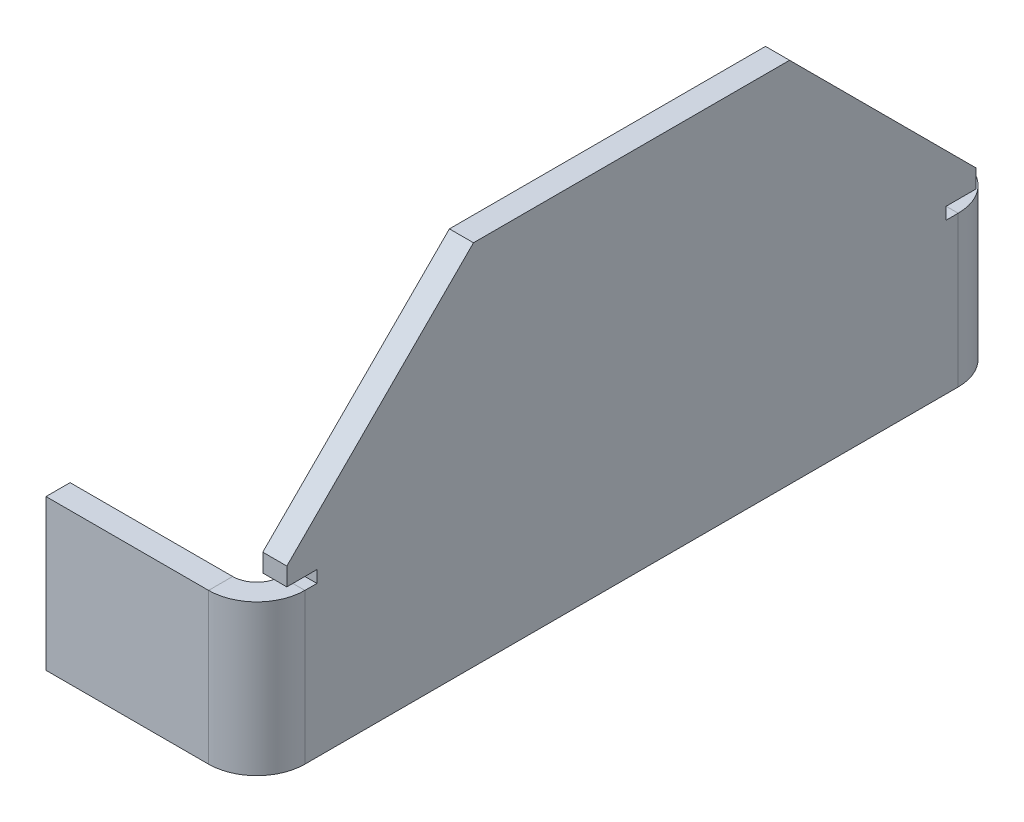
ISO-10303-21;
HEADER;
FILE_DESCRIPTION(('STEP AP214'),'2;1');
FILE_NAME('part.step','',(''),(''),'','','');
FILE_SCHEMA(('AUTOMOTIVE_DESIGN { 1 0 10303 214 1 1 1 1 }'));
ENDSEC;
DATA;
#1=APPLICATION_CONTEXT('core data for automotive mechanical design processes');
#2=APPLICATION_PROTOCOL_DEFINITION('international standard','automotive_design',2000,#1);
#3=PRODUCT_CONTEXT('',#1,'mechanical');
#4=PRODUCT('Part','Part','',(#3));
#5=PRODUCT_RELATED_PRODUCT_CATEGORY('part','',(#4));
#6=PRODUCT_DEFINITION_FORMATION('','',#4);
#7=PRODUCT_DEFINITION_CONTEXT('part definition',#1,'design');
#8=PRODUCT_DEFINITION('design','',#6,#7);
#9=PRODUCT_DEFINITION_SHAPE('','',#8);
#10=(LENGTH_UNIT() NAMED_UNIT(*) SI_UNIT(.MILLI.,.METRE.));
#11=(NAMED_UNIT(*) PLANE_ANGLE_UNIT() SI_UNIT($,.RADIAN.));
#12=(NAMED_UNIT(*) SI_UNIT($,.STERADIAN.) SOLID_ANGLE_UNIT());
#13=UNCERTAINTY_MEASURE_WITH_UNIT(LENGTH_MEASURE(1.E-05),#10,'distance_accuracy_value','');
#14=(GEOMETRIC_REPRESENTATION_CONTEXT(3) GLOBAL_UNCERTAINTY_ASSIGNED_CONTEXT((#13)) GLOBAL_UNIT_ASSIGNED_CONTEXT((#10,
#11,#12)) REPRESENTATION_CONTEXT('',''));
#15=CARTESIAN_POINT('',(0.,0.,0.));
#16=DIRECTION('',(0.,0.,1.));
#17=DIRECTION('',(1.,0.,0.));
#18=AXIS2_PLACEMENT_3D('',#15,#16,#17);
#19=CARTESIAN_POINT('',(-8.,0.,0.));
#20=DIRECTION('',(1.,0.,0.));
#21=DIRECTION('',(0.,0.,-1.));
#22=AXIS2_PLACEMENT_3D('',#19,#20,#21);
#23=PLANE('',#22);
#24=DIRECTION('',(0.,-1.,0.));
#25=VECTOR('',#24,1.);
#26=CARTESIAN_POINT('',(-7.99999999999997,0.,-108.500000000001));
#27=LINE('',#26,#25);
#28=CARTESIAN_POINT('',(-7.99999999999997,0.,-108.500000000001));
#29=VERTEX_POINT('',#28);
#30=CARTESIAN_POINT('',(-7.99999999999997,50.,-108.500000000001));
#31=VERTEX_POINT('',#30);
#32=EDGE_CURVE('E293',#29,#31,#27,.F.);
#33=ORIENTED_EDGE('',*,*,#32,.F.);
#34=DIRECTION('',(0.,0.,-1.));
#35=VECTOR('',#34,1.);
#36=CARTESIAN_POINT('',(-8.,0.,124.500000000001));
#37=LINE('',#36,#35);
#38=CARTESIAN_POINT('',(-7.99999999999999,0.,108.500000000001));
#39=VERTEX_POINT('',#38);
#40=EDGE_CURVE('E394',#39,#29,#37,.T.);
#41=ORIENTED_EDGE('',*,*,#40,.F.);
#42=DIRECTION('',(0.,1.,0.));
#43=VECTOR('',#42,1.);
#44=CARTESIAN_POINT('',(-7.99999999999999,50.,108.500000000001));
#45=LINE('',#44,#43);
#46=CARTESIAN_POINT('',(-7.99999999999999,50.,108.500000000001));
#47=VERTEX_POINT('',#46);
#48=EDGE_CURVE('E346',#47,#39,#45,.F.);
#49=ORIENTED_EDGE('',*,*,#48,.F.);
#50=DIRECTION('',(0.,0.,1.));
#51=VECTOR('',#50,1.);
#52=CARTESIAN_POINT('',(-7.99999999999999,50.,104.500000000001));
#53=LINE('',#52,#51);
#54=CARTESIAN_POINT('',(-7.99999999999999,50.,104.500000000001));
#55=VERTEX_POINT('',#54);
#56=EDGE_CURVE('E379',#55,#47,#53,.T.);
#57=ORIENTED_EDGE('',*,*,#56,.F.);
#58=DIRECTION('',(0.,-1.,0.));
#59=VECTOR('',#58,1.);
#60=CARTESIAN_POINT('',(-7.99999999999999,54.,104.500000000001));
#61=LINE('',#60,#59);
#62=CARTESIAN_POINT('',(-7.99999999999999,54.,104.500000000001));
#63=VERTEX_POINT('',#62);
#64=EDGE_CURVE('E375',#63,#55,#61,.T.);
#65=ORIENTED_EDGE('',*,*,#64,.F.);
#66=DIRECTION('',(0.,0.,-1.));
#67=VECTOR('',#66,1.);
#68=CARTESIAN_POINT('',(-7.99999999999999,54.,124.500000000001));
#69=LINE('',#68,#67);
#70=CARTESIAN_POINT('',(-7.99999999999999,54.,114.500000000001));
#71=VERTEX_POINT('',#70);
#72=EDGE_CURVE('E372',#71,#63,#69,.T.);
#73=ORIENTED_EDGE('',*,*,#72,.F.);
#74=DIRECTION('',(0.,-1.,0.));
#75=VECTOR('',#74,1.);
#76=CARTESIAN_POINT('',(-8.,60.,114.500000000001));
#77=LINE('',#76,#75);
#78=CARTESIAN_POINT('',(-8.,60.,114.500000000001));
#79=VERTEX_POINT('',#78);
#80=EDGE_CURVE('E391',#79,#71,#77,.T.);
#81=ORIENTED_EDGE('',*,*,#80,.F.);
#82=DIRECTION('',(0.,-0.707106781186544,0.707106781186551));
#83=VECTOR('',#82,1.);
#84=CARTESIAN_POINT('',(-8.,122.,52.5));
#85=LINE('',#84,#83);
#86=CARTESIAN_POINT('',(-8.,122.,52.5));
#87=VERTEX_POINT('',#86);
#88=EDGE_CURVE('E389',#87,#79,#85,.T.);
#89=ORIENTED_EDGE('',*,*,#88,.F.);
#90=DIRECTION('',(0.,0.,1.));
#91=VECTOR('',#90,1.);
#92=CARTESIAN_POINT('',(-8.,122.,52.5));
#93=LINE('',#92,#91);
#94=CARTESIAN_POINT('',(-8.,122.,-52.5));
#95=VERTEX_POINT('',#94);
#96=EDGE_CURVE('E402',#95,#87,#93,.T.);
#97=ORIENTED_EDGE('',*,*,#96,.F.);
#98=DIRECTION('',(0.,0.707106781186544,0.707106781186551));
#99=VECTOR('',#98,1.);
#100=CARTESIAN_POINT('',(-8.,122.,-52.5));
#101=LINE('',#100,#99);
#102=CARTESIAN_POINT('',(-8.,60.,-114.500000000001));
#103=VERTEX_POINT('',#102);
#104=EDGE_CURVE('E399',#103,#95,#101,.T.);
#105=ORIENTED_EDGE('',*,*,#104,.F.);
#106=DIRECTION('',(0.,1.,0.));
#107=VECTOR('',#106,1.);
#108=CARTESIAN_POINT('',(-8.,60.,-114.500000000001));
#109=LINE('',#108,#107);
#110=CARTESIAN_POINT('',(-7.99999999999997,54.,-114.500000000001));
#111=VERTEX_POINT('',#110);
#112=EDGE_CURVE('E397',#111,#103,#109,.T.);
#113=ORIENTED_EDGE('',*,*,#112,.F.);
#114=DIRECTION('',(0.,0.,-1.));
#115=VECTOR('',#114,1.);
#116=CARTESIAN_POINT('',(-7.99999999999997,54.,-104.500000000001));
#117=LINE('',#116,#115);
#118=CARTESIAN_POINT('',(-7.99999999999997,54.,-104.500000000001));
#119=VERTEX_POINT('',#118);
#120=EDGE_CURVE('E363',#119,#111,#117,.T.);
#121=ORIENTED_EDGE('',*,*,#120,.F.);
#122=DIRECTION('',(0.,1.,0.));
#123=VECTOR('',#122,1.);
#124=CARTESIAN_POINT('',(-7.99999999999997,50.,-104.500000000001));
#125=LINE('',#124,#123);
#126=CARTESIAN_POINT('',(-7.99999999999997,50.,-104.500000000001));
#127=VERTEX_POINT('',#126);
#128=EDGE_CURVE('E359',#127,#119,#125,.T.);
#129=ORIENTED_EDGE('',*,*,#128,.F.);
#130=DIRECTION('',(0.,0.,1.));
#131=VECTOR('',#130,1.);
#132=CARTESIAN_POINT('',(-7.99999999999997,50.,-108.500000000001));
#133=LINE('',#132,#131);
#134=EDGE_CURVE('E355',#31,#127,#133,.T.);
#135=ORIENTED_EDGE('',*,*,#134,.F.);
#136=EDGE_LOOP('',(#33,#41,#49,#57,#65,#73,#81,#89,#97,#105,#113,#121,#129,#135));
#137=FACE_BOUND('',#136,.T.);
#138=ADVANCED_FACE('F78',(#137),#23,.F.);
#139=CARTESIAN_POINT('',(0.,0.,0.));
#140=DIRECTION('',(1.,0.,0.));
#141=DIRECTION('',(0.,0.,-1.));
#142=AXIS2_PLACEMENT_3D('',#139,#140,#141);
#143=PLANE('',#142);
#144=DIRECTION('',(0.,0.,-1.));
#145=VECTOR('',#144,1.);
#146=CARTESIAN_POINT('',(0.,0.,124.500000000001));
#147=LINE('',#146,#145);
#148=CARTESIAN_POINT('',(0.,0.,108.500000000001));
#149=VERTEX_POINT('',#148);
#150=CARTESIAN_POINT('',(0.,0.,-108.500000000001));
#151=VERTEX_POINT('',#150);
#152=EDGE_CURVE('E409',#149,#151,#147,.T.);
#153=ORIENTED_EDGE('',*,*,#152,.T.);
#154=DIRECTION('',(0.,-1.,0.));
#155=VECTOR('',#154,1.);
#156=CARTESIAN_POINT('',(0.,0.,-108.500000000001));
#157=LINE('',#156,#155);
#158=CARTESIAN_POINT('',(0.,50.,-108.500000000001));
#159=VERTEX_POINT('',#158);
#160=EDGE_CURVE('E280',#151,#159,#157,.F.);
#161=ORIENTED_EDGE('',*,*,#160,.T.);
#162=DIRECTION('',(0.,0.,1.));
#163=VECTOR('',#162,1.);
#164=CARTESIAN_POINT('',(0.,50.,0.));
#165=LINE('',#164,#163);
#166=CARTESIAN_POINT('',(0.,50.,-104.500000000001));
#167=VERTEX_POINT('',#166);
#168=EDGE_CURVE('E13',#159,#167,#165,.T.);
#169=ORIENTED_EDGE('',*,*,#168,.T.);
#170=DIRECTION('',(0.,1.,0.));
#171=VECTOR('',#170,1.);
#172=CARTESIAN_POINT('',(0.,0.,-104.500000000001));
#173=LINE('',#172,#171);
#174=CARTESIAN_POINT('',(0.,54.,-104.500000000001));
#175=VERTEX_POINT('',#174);
#176=EDGE_CURVE('E86',#167,#175,#173,.T.);
#177=ORIENTED_EDGE('',*,*,#176,.T.);
#178=DIRECTION('',(0.,0.,-1.));
#179=VECTOR('',#178,1.);
#180=CARTESIAN_POINT('',(0.,54.0000000000001,0.));
#181=LINE('',#180,#179);
#182=CARTESIAN_POINT('',(0.,54.,-114.500000000001));
#183=VERTEX_POINT('',#182);
#184=EDGE_CURVE('E358',#175,#183,#181,.T.);
#185=ORIENTED_EDGE('',*,*,#184,.T.);
#186=DIRECTION('',(0.,1.,0.));
#187=VECTOR('',#186,1.);
#188=CARTESIAN_POINT('',(0.,60.,-114.500000000001));
#189=LINE('',#188,#187);
#190=CARTESIAN_POINT('',(0.,60.,-114.500000000001));
#191=VERTEX_POINT('',#190);
#192=EDGE_CURVE('E412',#183,#191,#189,.T.);
#193=ORIENTED_EDGE('',*,*,#192,.T.);
#194=DIRECTION('',(0.,0.707106781186544,0.707106781186551));
#195=VECTOR('',#194,1.);
#196=CARTESIAN_POINT('',(0.,122.,-52.5));
#197=LINE('',#196,#195);
#198=CARTESIAN_POINT('',(0.,122.,-52.5));
#199=VERTEX_POINT('',#198);
#200=EDGE_CURVE('E414',#191,#199,#197,.T.);
#201=ORIENTED_EDGE('',*,*,#200,.T.);
#202=DIRECTION('',(0.,0.,1.));
#203=VECTOR('',#202,1.);
#204=CARTESIAN_POINT('',(0.,122.,52.5));
#205=LINE('',#204,#203);
#206=CARTESIAN_POINT('',(0.,122.,52.5));
#207=VERTEX_POINT('',#206);
#208=EDGE_CURVE('E392',#199,#207,#205,.T.);
#209=ORIENTED_EDGE('',*,*,#208,.T.);
#210=DIRECTION('',(0.,-0.707106781186544,0.707106781186551));
#211=VECTOR('',#210,1.);
#212=CARTESIAN_POINT('',(0.,122.,52.5));
#213=LINE('',#212,#211);
#214=CARTESIAN_POINT('',(0.,60.,114.500000000001));
#215=VERTEX_POINT('',#214);
#216=EDGE_CURVE('E388',#207,#215,#213,.T.);
#217=ORIENTED_EDGE('',*,*,#216,.T.);
#218=DIRECTION('',(0.,-1.,0.));
#219=VECTOR('',#218,1.);
#220=CARTESIAN_POINT('',(0.,60.,114.500000000001));
#221=LINE('',#220,#219);
#222=CARTESIAN_POINT('',(0.,54.,114.500000000001));
#223=VERTEX_POINT('',#222);
#224=EDGE_CURVE('E406',#215,#223,#221,.T.);
#225=ORIENTED_EDGE('',*,*,#224,.T.);
#226=DIRECTION('',(0.,0.,-1.));
#227=VECTOR('',#226,1.);
#228=CARTESIAN_POINT('',(0.,54.0000000000001,0.));
#229=LINE('',#228,#227);
#230=CARTESIAN_POINT('',(0.,54.,104.500000000001));
#231=VERTEX_POINT('',#230);
#232=EDGE_CURVE('E432',#223,#231,#229,.T.);
#233=ORIENTED_EDGE('',*,*,#232,.T.);
#234=DIRECTION('',(0.,-1.,0.));
#235=VECTOR('',#234,1.);
#236=CARTESIAN_POINT('',(0.,0.,104.500000000001));
#237=LINE('',#236,#235);
#238=CARTESIAN_POINT('',(0.,50.,104.500000000001));
#239=VERTEX_POINT('',#238);
#240=EDGE_CURVE('E429',#231,#239,#237,.T.);
#241=ORIENTED_EDGE('',*,*,#240,.T.);
#242=DIRECTION('',(0.,0.,1.));
#243=VECTOR('',#242,1.);
#244=CARTESIAN_POINT('',(0.,50.,0.));
#245=LINE('',#244,#243);
#246=CARTESIAN_POINT('',(0.,50.,108.500000000001));
#247=VERTEX_POINT('',#246);
#248=EDGE_CURVE('E420',#239,#247,#245,.T.);
#249=ORIENTED_EDGE('',*,*,#248,.T.);
#250=DIRECTION('',(0.,1.,0.));
#251=VECTOR('',#250,1.);
#252=CARTESIAN_POINT('',(0.,50.,108.500000000001));
#253=LINE('',#252,#251);
#254=EDGE_CURVE('E335',#247,#149,#253,.F.);
#255=ORIENTED_EDGE('',*,*,#254,.T.);
#256=EDGE_LOOP('',(#153,#161,#169,#177,#185,#193,#201,#209,#217,#225,#233,#241,#249,#255));
#257=FACE_BOUND('',#256,.T.);
#258=ADVANCED_FACE('F439',(#257),#143,.T.);
#259=CARTESIAN_POINT('',(-8.,60.,-114.500000000001));
#260=DIRECTION('',(0.,0.,-1.));
#261=DIRECTION('',(-1.,0.,0.));
#262=AXIS2_PLACEMENT_3D('',#259,#260,#261);
#263=PLANE('',#262);
#264=ORIENTED_EDGE('',*,*,#192,.F.);
#265=DIRECTION('',(-1.,0.,0.));
#266=VECTOR('',#265,1.);
#267=CARTESIAN_POINT('',(-8.,54.,-114.500000000001));
#268=LINE('',#267,#266);
#269=EDGE_CURVE('E435',#183,#111,#268,.T.);
#270=ORIENTED_EDGE('',*,*,#269,.T.);
#271=ORIENTED_EDGE('',*,*,#112,.T.);
#272=DIRECTION('',(1.,0.,0.));
#273=VECTOR('',#272,1.);
#274=CARTESIAN_POINT('',(-8.,60.,-114.500000000001));
#275=LINE('',#274,#273);
#276=EDGE_CURVE('E423',#103,#191,#275,.T.);
#277=ORIENTED_EDGE('',*,*,#276,.T.);
#278=EDGE_LOOP('',(#264,#270,#271,#277));
#279=FACE_BOUND('',#278,.T.);
#280=ADVANCED_FACE('F457',(#279),#263,.T.);
#281=CARTESIAN_POINT('',(-8.,0.,124.500000000001));
#282=DIRECTION('',(0.,-1.,0.));
#283=DIRECTION('',(0.,0.,-1.));
#284=AXIS2_PLACEMENT_3D('',#281,#282,#283);
#285=PLANE('',#284);
#286=ORIENTED_EDGE('',*,*,#40,.T.);
#287=DIRECTION('',(1.,0.,0.));
#288=VECTOR('',#287,1.);
#289=CARTESIAN_POINT('',(-7.99999999999997,0.,-108.500000000001));
#290=LINE('',#289,#288);
#291=EDGE_CURVE('E287',#29,#151,#290,.T.);
#292=ORIENTED_EDGE('',*,*,#291,.T.);
#293=ORIENTED_EDGE('',*,*,#152,.F.);
#294=DIRECTION('',(1.,0.,0.));
#295=VECTOR('',#294,1.);
#296=CARTESIAN_POINT('',(-7.99999999999999,0.,108.500000000001));
#297=LINE('',#296,#295);
#298=EDGE_CURVE('E350',#39,#149,#297,.T.);
#299=ORIENTED_EDGE('',*,*,#298,.F.);
#300=EDGE_LOOP('',(#286,#292,#293,#299));
#301=FACE_BOUND('',#300,.T.);
#302=ADVANCED_FACE('F480',(#301),#285,.T.);
#303=CARTESIAN_POINT('',(-8.,60.,114.500000000001));
#304=DIRECTION('',(0.,0.,1.));
#305=DIRECTION('',(1.,0.,0.));
#306=AXIS2_PLACEMENT_3D('',#303,#304,#305);
#307=PLANE('',#306);
#308=ORIENTED_EDGE('',*,*,#80,.T.);
#309=DIRECTION('',(1.,0.,0.));
#310=VECTOR('',#309,1.);
#311=CARTESIAN_POINT('',(-8.,54.,114.500000000001));
#312=LINE('',#311,#310);
#313=EDGE_CURVE('E374',#71,#223,#312,.T.);
#314=ORIENTED_EDGE('',*,*,#313,.T.);
#315=ORIENTED_EDGE('',*,*,#224,.F.);
#316=DIRECTION('',(1.,0.,0.));
#317=VECTOR('',#316,1.);
#318=CARTESIAN_POINT('',(-8.,60.,114.500000000001));
#319=LINE('',#318,#317);
#320=EDGE_CURVE('E128',#79,#215,#319,.T.);
#321=ORIENTED_EDGE('',*,*,#320,.F.);
#322=EDGE_LOOP('',(#308,#314,#315,#321));
#323=FACE_BOUND('',#322,.T.);
#324=ADVANCED_FACE('F465',(#323),#307,.T.);
#325=CARTESIAN_POINT('',(-8.,122.,52.5));
#326=DIRECTION('',(0.,0.707106781186551,0.707106781186544));
#327=DIRECTION('',(0.,-0.707106781186544,0.707106781186551));
#328=AXIS2_PLACEMENT_3D('',#325,#326,#327);
#329=PLANE('',#328);
#330=ORIENTED_EDGE('',*,*,#216,.F.);
#331=DIRECTION('',(1.,0.,0.));
#332=VECTOR('',#331,1.);
#333=CARTESIAN_POINT('',(-8.,122.,52.5));
#334=LINE('',#333,#332);
#335=EDGE_CURVE('E102',#87,#207,#334,.T.);
#336=ORIENTED_EDGE('',*,*,#335,.F.);
#337=ORIENTED_EDGE('',*,*,#88,.T.);
#338=ORIENTED_EDGE('',*,*,#320,.T.);
#339=EDGE_LOOP('',(#330,#336,#337,#338));
#340=FACE_BOUND('',#339,.T.);
#341=ADVANCED_FACE('F80',(#340),#329,.T.);
#342=CARTESIAN_POINT('',(-8.,122.,52.5));
#343=DIRECTION('',(0.,1.,0.));
#344=DIRECTION('',(0.,0.,1.));
#345=AXIS2_PLACEMENT_3D('',#342,#343,#344);
#346=PLANE('',#345);
#347=ORIENTED_EDGE('',*,*,#208,.F.);
#348=DIRECTION('',(1.,0.,0.));
#349=VECTOR('',#348,1.);
#350=CARTESIAN_POINT('',(-8.,122.,-52.5));
#351=LINE('',#350,#349);
#352=EDGE_CURVE('E421',#95,#199,#351,.T.);
#353=ORIENTED_EDGE('',*,*,#352,.F.);
#354=ORIENTED_EDGE('',*,*,#96,.T.);
#355=ORIENTED_EDGE('',*,*,#335,.T.);
#356=EDGE_LOOP('',(#347,#353,#354,#355));
#357=FACE_BOUND('',#356,.T.);
#358=ADVANCED_FACE('F461',(#357),#346,.T.);
#359=CARTESIAN_POINT('',(-8.,122.,-52.5));
#360=DIRECTION('',(0.,0.707106781186552,-0.707106781186544));
#361=DIRECTION('',(0.,0.707106781186544,0.707106781186552));
#362=AXIS2_PLACEMENT_3D('',#359,#360,#361);
#363=PLANE('',#362);
#364=ORIENTED_EDGE('',*,*,#200,.F.);
#365=ORIENTED_EDGE('',*,*,#276,.F.);
#366=ORIENTED_EDGE('',*,*,#104,.T.);
#367=ORIENTED_EDGE('',*,*,#352,.T.);
#368=EDGE_LOOP('',(#364,#365,#366,#367));
#369=FACE_BOUND('',#368,.T.);
#370=ADVANCED_FACE('F463',(#369),#363,.T.);
#371=CARTESIAN_POINT('',(-7.99999999999999,54.,124.500000000001));
#372=DIRECTION('',(0.,-1.,0.));
#373=DIRECTION('',(0.,0.,-1.));
#374=AXIS2_PLACEMENT_3D('',#371,#372,#373);
#375=PLANE('',#374);
#376=ORIENTED_EDGE('',*,*,#313,.F.);
#377=ORIENTED_EDGE('',*,*,#72,.T.);
#378=DIRECTION('',(1.,0.,0.));
#379=VECTOR('',#378,1.);
#380=CARTESIAN_POINT('',(-7.99999999999999,54.,104.500000000001));
#381=LINE('',#380,#379);
#382=EDGE_CURVE('E378',#63,#231,#381,.T.);
#383=ORIENTED_EDGE('',*,*,#382,.T.);
#384=ORIENTED_EDGE('',*,*,#232,.F.);
#385=EDGE_LOOP('',(#376,#377,#383,#384));
#386=FACE_BOUND('',#385,.T.);
#387=ADVANCED_FACE('F467',(#386),#375,.T.);
#388=CARTESIAN_POINT('',(-7.99999999999999,54.,104.500000000001));
#389=DIRECTION('',(0.,0.,1.));
#390=DIRECTION('',(1.,0.,0.));
#391=AXIS2_PLACEMENT_3D('',#388,#389,#390);
#392=PLANE('',#391);
#393=ORIENTED_EDGE('',*,*,#240,.F.);
#394=ORIENTED_EDGE('',*,*,#382,.F.);
#395=ORIENTED_EDGE('',*,*,#64,.T.);
#396=DIRECTION('',(1.,0.,0.));
#397=VECTOR('',#396,1.);
#398=CARTESIAN_POINT('',(-7.99999999999999,50.,104.500000000001));
#399=LINE('',#398,#397);
#400=EDGE_CURVE('E371',#55,#239,#399,.T.);
#401=ORIENTED_EDGE('',*,*,#400,.T.);
#402=EDGE_LOOP('',(#393,#394,#395,#401));
#403=FACE_BOUND('',#402,.T.);
#404=ADVANCED_FACE('F471',(#403),#392,.T.);
#405=CARTESIAN_POINT('',(-7.99999999999999,50.,104.500000000001));
#406=DIRECTION('',(0.,1.,0.));
#407=DIRECTION('',(0.,0.,1.));
#408=AXIS2_PLACEMENT_3D('',#405,#406,#407);
#409=PLANE('',#408);
#410=ORIENTED_EDGE('',*,*,#248,.F.);
#411=ORIENTED_EDGE('',*,*,#400,.F.);
#412=ORIENTED_EDGE('',*,*,#56,.T.);
#413=DIRECTION('',(1.,0.,0.));
#414=VECTOR('',#413,1.);
#415=CARTESIAN_POINT('',(-7.99999999999999,50.,108.500000000001));
#416=LINE('',#415,#414);
#417=EDGE_CURVE('E340',#47,#247,#416,.T.);
#418=ORIENTED_EDGE('',*,*,#417,.T.);
#419=EDGE_LOOP('',(#410,#411,#412,#418));
#420=FACE_BOUND('',#419,.T.);
#421=ADVANCED_FACE('F476',(#420),#409,.T.);
#422=CARTESIAN_POINT('',(-7.99999999999997,50.,-108.500000000001));
#423=DIRECTION('',(0.,1.,0.));
#424=DIRECTION('',(0.,0.,1.));
#425=AXIS2_PLACEMENT_3D('',#422,#423,#424);
#426=PLANE('',#425);
#427=ORIENTED_EDGE('',*,*,#168,.F.);
#428=DIRECTION('',(1.,0.,0.));
#429=VECTOR('',#428,1.);
#430=CARTESIAN_POINT('',(-7.99999999999997,50.,-108.500000000001));
#431=LINE('',#430,#429);
#432=EDGE_CURVE('E297',#31,#159,#431,.T.);
#433=ORIENTED_EDGE('',*,*,#432,.F.);
#434=ORIENTED_EDGE('',*,*,#134,.T.);
#435=DIRECTION('',(1.,0.,0.));
#436=VECTOR('',#435,1.);
#437=CARTESIAN_POINT('',(-7.99999999999997,50.,-104.500000000001));
#438=LINE('',#437,#436);
#439=EDGE_CURVE('E362',#127,#167,#438,.T.);
#440=ORIENTED_EDGE('',*,*,#439,.T.);
#441=EDGE_LOOP('',(#427,#433,#434,#440));
#442=FACE_BOUND('',#441,.T.);
#443=ADVANCED_FACE('F445',(#442),#426,.T.);
#444=CARTESIAN_POINT('',(-7.99999999999997,50.,-104.500000000001));
#445=DIRECTION('',(0.,0.,-1.));
#446=DIRECTION('',(-1.,0.,0.));
#447=AXIS2_PLACEMENT_3D('',#444,#445,#446);
#448=PLANE('',#447);
#449=ORIENTED_EDGE('',*,*,#176,.F.);
#450=ORIENTED_EDGE('',*,*,#439,.F.);
#451=ORIENTED_EDGE('',*,*,#128,.T.);
#452=DIRECTION('',(1.,0.,0.));
#453=VECTOR('',#452,1.);
#454=CARTESIAN_POINT('',(-7.99999999999997,54.,-104.500000000001));
#455=LINE('',#454,#453);
#456=EDGE_CURVE('E352',#119,#175,#455,.T.);
#457=ORIENTED_EDGE('',*,*,#456,.T.);
#458=EDGE_LOOP('',(#449,#450,#451,#457));
#459=FACE_BOUND('',#458,.T.);
#460=ADVANCED_FACE('F443',(#459),#448,.T.);
#461=CARTESIAN_POINT('',(-7.99999999999997,54.,-104.500000000001));
#462=DIRECTION('',(0.,-1.,0.));
#463=DIRECTION('',(0.,0.,-1.));
#464=AXIS2_PLACEMENT_3D('',#461,#462,#463);
#465=PLANE('',#464);
#466=ORIENTED_EDGE('',*,*,#184,.F.);
#467=ORIENTED_EDGE('',*,*,#456,.F.);
#468=ORIENTED_EDGE('',*,*,#120,.T.);
#469=ORIENTED_EDGE('',*,*,#269,.F.);
#470=EDGE_LOOP('',(#466,#467,#468,#469));
#471=FACE_BOUND('',#470,.T.);
#472=ADVANCED_FACE('F455',(#471),#465,.T.);
#473=CARTESIAN_POINT('',(-16.,0.,108.500000000001));
#474=DIRECTION('',(0.,-1.,0.));
#475=DIRECTION('',(0.,0.,-1.));
#476=AXIS2_PLACEMENT_3D('',#473,#474,#475);
#477=PLANE('',#476);
#478=DIRECTION('',(0.,0.,1.));
#479=VECTOR('',#478,1.);
#480=CARTESIAN_POINT('',(-16.,0.,124.500000000001));
#481=LINE('',#480,#479);
#482=CARTESIAN_POINT('',(-16.,0.,116.500000000001));
#483=VERTEX_POINT('',#482);
#484=CARTESIAN_POINT('',(-15.9999999999999,0.,124.500000000001));
#485=VERTEX_POINT('',#484);
#486=EDGE_CURVE('E300',#483,#485,#481,.T.);
#487=ORIENTED_EDGE('',*,*,#486,.F.);
#488=CARTESIAN_POINT('',(-16.,0.,108.500000000001));
#489=DIRECTION('',(0.,1.,0.));
#490=DIRECTION('',(0.,0.,1.));
#491=AXIS2_PLACEMENT_3D('',#488,#489,#490);
#492=CIRCLE('',#491,7.99999999999999);
#493=EDGE_CURVE('E343',#39,#483,#492,.F.);
#494=ORIENTED_EDGE('',*,*,#493,.F.);
#495=ORIENTED_EDGE('',*,*,#298,.T.);
#496=CARTESIAN_POINT('',(-16.,0.,108.500000000001));
#497=DIRECTION('',(0.,1.,0.));
#498=DIRECTION('',(0.,0.,1.));
#499=AXIS2_PLACEMENT_3D('',#496,#497,#498);
#500=CIRCLE('',#499,16.);
#501=EDGE_CURVE('E93',#149,#485,#500,.F.);
#502=ORIENTED_EDGE('',*,*,#501,.T.);
#503=EDGE_LOOP('',(#487,#494,#495,#502));
#504=FACE_BOUND('',#503,.T.);
#505=ADVANCED_FACE('F570',(#504),#477,.T.);
#506=CARTESIAN_POINT('',(-16.,50.,108.500000000001));
#507=DIRECTION('',(0.,-1.,0.));
#508=DIRECTION('',(0.,0.,-1.));
#509=AXIS2_PLACEMENT_3D('',#506,#507,#508);
#510=PLANE('',#509);
#511=CARTESIAN_POINT('',(-16.,50.,108.500000000001));
#512=DIRECTION('',(0.,1.,0.));
#513=DIRECTION('',(0.,0.,1.));
#514=AXIS2_PLACEMENT_3D('',#511,#512,#513);
#515=CIRCLE('',#514,7.99999999999999);
#516=CARTESIAN_POINT('',(-16.,50.,116.500000000001));
#517=VERTEX_POINT('',#516);
#518=EDGE_CURVE('E305',#517,#47,#515,.T.);
#519=ORIENTED_EDGE('',*,*,#518,.F.);
#520=DIRECTION('',(0.,0.,1.));
#521=VECTOR('',#520,1.);
#522=CARTESIAN_POINT('',(-16.,50.,116.500000000001));
#523=LINE('',#522,#521);
#524=CARTESIAN_POINT('',(-16.,50.,124.500000000001));
#525=VERTEX_POINT('',#524);
#526=EDGE_CURVE('E328',#517,#525,#523,.T.);
#527=ORIENTED_EDGE('',*,*,#526,.T.);
#528=CARTESIAN_POINT('',(-16.,50.,108.500000000001));
#529=DIRECTION('',(0.,1.,0.));
#530=DIRECTION('',(0.,0.,1.));
#531=AXIS2_PLACEMENT_3D('',#528,#529,#530);
#532=CIRCLE('',#531,16.);
#533=EDGE_CURVE('E338',#525,#247,#532,.T.);
#534=ORIENTED_EDGE('',*,*,#533,.T.);
#535=ORIENTED_EDGE('',*,*,#417,.F.);
#536=EDGE_LOOP('',(#519,#527,#534,#535));
#537=FACE_BOUND('',#536,.T.);
#538=ADVANCED_FACE('F577',(#537),#510,.F.);
#539=CARTESIAN_POINT('',(-16.,50.,108.500000000001));
#540=DIRECTION('',(0.,1.,0.));
#541=DIRECTION('',(0.,0.,1.));
#542=AXIS2_PLACEMENT_3D('',#539,#540,#541);
#543=CYLINDRICAL_SURFACE('',#542,16.);
#544=ORIENTED_EDGE('',*,*,#254,.F.);
#545=ORIENTED_EDGE('',*,*,#533,.F.);
#546=DIRECTION('',(0.,1.,0.));
#547=VECTOR('',#546,1.);
#548=CARTESIAN_POINT('',(-16.,0.,124.500000000001));
#549=LINE('',#548,#547);
#550=EDGE_CURVE('E325',#485,#525,#549,.T.);
#551=ORIENTED_EDGE('',*,*,#550,.F.);
#552=ORIENTED_EDGE('',*,*,#501,.F.);
#553=EDGE_LOOP('',(#544,#545,#551,#552));
#554=FACE_BOUND('',#553,.T.);
#555=ADVANCED_FACE('F585',(#554),#543,.T.);
#556=CARTESIAN_POINT('',(-16.,50.,108.500000000001));
#557=DIRECTION('',(0.,1.,0.));
#558=DIRECTION('',(0.,0.,1.));
#559=AXIS2_PLACEMENT_3D('',#556,#557,#558);
#560=CYLINDRICAL_SURFACE('',#559,7.99999999999999);
#561=ORIENTED_EDGE('',*,*,#48,.T.);
#562=ORIENTED_EDGE('',*,*,#493,.T.);
#563=DIRECTION('',(0.,-1.,0.));
#564=VECTOR('',#563,1.);
#565=CARTESIAN_POINT('',(-16.,0.,116.500000000001));
#566=LINE('',#565,#564);
#567=EDGE_CURVE('E331',#483,#517,#566,.F.);
#568=ORIENTED_EDGE('',*,*,#567,.T.);
#569=ORIENTED_EDGE('',*,*,#518,.T.);
#570=EDGE_LOOP('',(#561,#562,#568,#569));
#571=FACE_BOUND('',#570,.T.);
#572=ADVANCED_FACE('F593',(#571),#560,.F.);
#573=CARTESIAN_POINT('',(-7.99999999999997,50.,124.500000000001));
#574=DIRECTION('',(0.,1.,0.));
#575=DIRECTION('',(-1.,0.,0.));
#576=AXIS2_PLACEMENT_3D('',#573,#574,#575);
#577=PLANE('',#576);
#578=DIRECTION('',(1.,0.,0.));
#579=VECTOR('',#578,1.);
#580=CARTESIAN_POINT('',(-7.99999999999997,50.,124.500000000001));
#581=LINE('',#580,#579);
#582=CARTESIAN_POINT('',(-70.,49.9999999999999,124.500000000001));
#583=VERTEX_POINT('',#582);
#584=EDGE_CURVE('E309',#583,#525,#581,.T.);
#585=ORIENTED_EDGE('',*,*,#584,.T.);
#586=ORIENTED_EDGE('',*,*,#526,.F.);
#587=DIRECTION('',(-1.,0.,0.));
#588=VECTOR('',#587,1.);
#589=CARTESIAN_POINT('',(3.89921070342144E-13,50.,116.500000000001));
#590=LINE('',#589,#588);
#591=CARTESIAN_POINT('',(-70.,49.9999999999999,116.500000000001));
#592=VERTEX_POINT('',#591);
#593=EDGE_CURVE('E317',#592,#517,#590,.F.);
#594=ORIENTED_EDGE('',*,*,#593,.F.);
#595=DIRECTION('',(0.,0.,-1.));
#596=VECTOR('',#595,1.);
#597=CARTESIAN_POINT('',(-70.,49.9999999999999,124.500000000001));
#598=LINE('',#597,#596);
#599=EDGE_CURVE('E303',#583,#592,#598,.T.);
#600=ORIENTED_EDGE('',*,*,#599,.F.);
#601=EDGE_LOOP('',(#585,#586,#594,#600));
#602=FACE_BOUND('',#601,.T.);
#603=ADVANCED_FACE('F600',(#602),#577,.T.);
#604=CARTESIAN_POINT('',(-70.,0.,124.500000000001));
#605=DIRECTION('',(0.,-1.,0.));
#606=DIRECTION('',(1.,0.,0.));
#607=AXIS2_PLACEMENT_3D('',#604,#605,#606);
#608=PLANE('',#607);
#609=DIRECTION('',(1.,0.,0.));
#610=VECTOR('',#609,1.);
#611=CARTESIAN_POINT('',(4.45879892147847E-13,0.,116.500000000001));
#612=LINE('',#611,#610);
#613=CARTESIAN_POINT('',(-70.,0.,116.500000000001));
#614=VERTEX_POINT('',#613);
#615=EDGE_CURVE('E323',#483,#614,#612,.F.);
#616=ORIENTED_EDGE('',*,*,#615,.F.);
#617=ORIENTED_EDGE('',*,*,#486,.T.);
#618=DIRECTION('',(-1.,0.,0.));
#619=VECTOR('',#618,1.);
#620=CARTESIAN_POINT('',(-70.,0.,124.500000000001));
#621=LINE('',#620,#619);
#622=CARTESIAN_POINT('',(-70.,0.,124.500000000001));
#623=VERTEX_POINT('',#622);
#624=EDGE_CURVE('E315',#485,#623,#621,.T.);
#625=ORIENTED_EDGE('',*,*,#624,.T.);
#626=DIRECTION('',(0.,0.,-1.));
#627=VECTOR('',#626,1.);
#628=CARTESIAN_POINT('',(-70.,0.,124.500000000001));
#629=LINE('',#628,#627);
#630=EDGE_CURVE('E306',#623,#614,#629,.T.);
#631=ORIENTED_EDGE('',*,*,#630,.T.);
#632=EDGE_LOOP('',(#616,#617,#625,#631));
#633=FACE_BOUND('',#632,.T.);
#634=ADVANCED_FACE('F608',(#633),#608,.T.);
#635=CARTESIAN_POINT('',(4.73811742858592E-13,0.,124.500000000001));
#636=DIRECTION('',(0.,0.,1.));
#637=DIRECTION('',(1.,0.,0.));
#638=AXIS2_PLACEMENT_3D('',#635,#636,#637);
#639=PLANE('',#638);
#640=ORIENTED_EDGE('',*,*,#624,.F.);
#641=ORIENTED_EDGE('',*,*,#550,.T.);
#642=ORIENTED_EDGE('',*,*,#584,.F.);
#643=DIRECTION('',(0.,1.,0.));
#644=VECTOR('',#643,1.);
#645=CARTESIAN_POINT('',(-70.,49.9999999999999,124.500000000001));
#646=LINE('',#645,#644);
#647=EDGE_CURVE('E312',#623,#583,#646,.T.);
#648=ORIENTED_EDGE('',*,*,#647,.F.);
#649=EDGE_LOOP('',(#640,#641,#642,#648));
#650=FACE_BOUND('',#649,.T.);
#651=ADVANCED_FACE('F616',(#650),#639,.T.);
#652=CARTESIAN_POINT('',(4.45879892147847E-13,0.,116.500000000001));
#653=DIRECTION('',(0.,0.,1.));
#654=DIRECTION('',(1.,0.,0.));
#655=AXIS2_PLACEMENT_3D('',#652,#653,#654);
#656=PLANE('',#655);
#657=ORIENTED_EDGE('',*,*,#567,.F.);
#658=ORIENTED_EDGE('',*,*,#615,.T.);
#659=DIRECTION('',(0.,-1.,0.));
#660=VECTOR('',#659,1.);
#661=CARTESIAN_POINT('',(-70.,0.,116.500000000001));
#662=LINE('',#661,#660);
#663=EDGE_CURVE('E320',#614,#592,#662,.F.);
#664=ORIENTED_EDGE('',*,*,#663,.T.);
#665=ORIENTED_EDGE('',*,*,#593,.T.);
#666=EDGE_LOOP('',(#657,#658,#664,#665));
#667=FACE_BOUND('',#666,.T.);
#668=ADVANCED_FACE('F624',(#667),#656,.F.);
#669=CARTESIAN_POINT('',(-70.,49.9999999999999,124.500000000001));
#670=DIRECTION('',(-1.,0.,0.));
#671=DIRECTION('',(0.,0.,1.));
#672=AXIS2_PLACEMENT_3D('',#669,#670,#671);
#673=PLANE('',#672);
#674=ORIENTED_EDGE('',*,*,#663,.F.);
#675=ORIENTED_EDGE('',*,*,#630,.F.);
#676=ORIENTED_EDGE('',*,*,#647,.T.);
#677=ORIENTED_EDGE('',*,*,#599,.T.);
#678=EDGE_LOOP('',(#674,#675,#676,#677));
#679=FACE_BOUND('',#678,.T.);
#680=ADVANCED_FACE('F632',(#679),#673,.T.);
#681=CARTESIAN_POINT('',(-16.,50.,-108.500000000001));
#682=DIRECTION('',(0.,1.,0.));
#683=DIRECTION('',(0.,0.,1.));
#684=AXIS2_PLACEMENT_3D('',#681,#682,#683);
#685=PLANE('',#684);
#686=DIRECTION('',(0.,0.,-1.));
#687=VECTOR('',#686,1.);
#688=CARTESIAN_POINT('',(-16.,50.,-124.500000000001));
#689=LINE('',#688,#687);
#690=CARTESIAN_POINT('',(-16.,50.,-116.500000000001));
#691=VERTEX_POINT('',#690);
#692=CARTESIAN_POINT('',(-15.9999999999999,50.,-124.500000000001));
#693=VERTEX_POINT('',#692);
#694=EDGE_CURVE('E277',#691,#693,#689,.T.);
#695=ORIENTED_EDGE('',*,*,#694,.F.);
#696=CARTESIAN_POINT('',(-16.,50.,-108.500000000001));
#697=DIRECTION('',(0.,-1.,0.));
#698=DIRECTION('',(0.,0.,-1.));
#699=AXIS2_PLACEMENT_3D('',#696,#697,#698);
#700=CIRCLE('',#699,8.00000000000002);
#701=EDGE_CURVE('E290',#31,#691,#700,.F.);
#702=ORIENTED_EDGE('',*,*,#701,.F.);
#703=ORIENTED_EDGE('',*,*,#432,.T.);
#704=CARTESIAN_POINT('',(-16.,50.,-108.500000000001));
#705=DIRECTION('',(0.,-1.,0.));
#706=DIRECTION('',(0.,0.,-1.));
#707=AXIS2_PLACEMENT_3D('',#704,#705,#706);
#708=CIRCLE('',#707,16.);
#709=EDGE_CURVE('E283',#159,#693,#708,.F.);
#710=ORIENTED_EDGE('',*,*,#709,.T.);
#711=EDGE_LOOP('',(#695,#702,#703,#710));
#712=FACE_BOUND('',#711,.T.);
#713=ADVANCED_FACE('F494',(#712),#685,.T.);
#714=CARTESIAN_POINT('',(-16.,0.,-108.500000000001));
#715=DIRECTION('',(0.,1.,0.));
#716=DIRECTION('',(0.,0.,1.));
#717=AXIS2_PLACEMENT_3D('',#714,#715,#716);
#718=PLANE('',#717);
#719=CARTESIAN_POINT('',(-16.,0.,-108.500000000001));
#720=DIRECTION('',(0.,-1.,0.));
#721=DIRECTION('',(0.,0.,-1.));
#722=AXIS2_PLACEMENT_3D('',#719,#720,#721);
#723=CIRCLE('',#722,8.00000000000002);
#724=CARTESIAN_POINT('',(-16.,0.,-116.500000000001));
#725=VERTEX_POINT('',#724);
#726=EDGE_CURVE('E247',#725,#29,#723,.T.);
#727=ORIENTED_EDGE('',*,*,#726,.F.);
#728=DIRECTION('',(0.,0.,-1.));
#729=VECTOR('',#728,1.);
#730=CARTESIAN_POINT('',(-16.,0.,-116.500000000001));
#731=LINE('',#730,#729);
#732=CARTESIAN_POINT('',(-16.,0.,-124.500000000001));
#733=VERTEX_POINT('',#732);
#734=EDGE_CURVE('E272',#725,#733,#731,.T.);
#735=ORIENTED_EDGE('',*,*,#734,.T.);
#736=CARTESIAN_POINT('',(-16.,0.,-108.500000000001));
#737=DIRECTION('',(0.,-1.,0.));
#738=DIRECTION('',(0.,0.,-1.));
#739=AXIS2_PLACEMENT_3D('',#736,#737,#738);
#740=CIRCLE('',#739,16.);
#741=EDGE_CURVE('E284',#733,#151,#740,.T.);
#742=ORIENTED_EDGE('',*,*,#741,.T.);
#743=ORIENTED_EDGE('',*,*,#291,.F.);
#744=EDGE_LOOP('',(#727,#735,#742,#743));
#745=FACE_BOUND('',#744,.T.);
#746=ADVANCED_FACE('F483',(#745),#718,.F.);
#747=CARTESIAN_POINT('',(-16.,0.,-108.500000000001));
#748=DIRECTION('',(0.,-1.,0.));
#749=DIRECTION('',(0.,0.,-1.));
#750=AXIS2_PLACEMENT_3D('',#747,#748,#749);
#751=CYLINDRICAL_SURFACE('',#750,16.);
#752=ORIENTED_EDGE('',*,*,#160,.F.);
#753=ORIENTED_EDGE('',*,*,#741,.F.);
#754=DIRECTION('',(0.,-1.,0.));
#755=VECTOR('',#754,1.);
#756=CARTESIAN_POINT('',(-16.,50.,-124.500000000001));
#757=LINE('',#756,#755);
#758=EDGE_CURVE('E256',#733,#693,#757,.F.);
#759=ORIENTED_EDGE('',*,*,#758,.T.);
#760=ORIENTED_EDGE('',*,*,#709,.F.);
#761=EDGE_LOOP('',(#752,#753,#759,#760));
#762=FACE_BOUND('',#761,.T.);
#763=ADVANCED_FACE('F496',(#762),#751,.T.);
#764=CARTESIAN_POINT('',(-16.,0.,-108.500000000001));
#765=DIRECTION('',(0.,-1.,0.));
#766=DIRECTION('',(0.,0.,-1.));
#767=AXIS2_PLACEMENT_3D('',#764,#765,#766);
#768=CYLINDRICAL_SURFACE('',#767,8.00000000000002);
#769=ORIENTED_EDGE('',*,*,#32,.T.);
#770=ORIENTED_EDGE('',*,*,#701,.T.);
#771=DIRECTION('',(0.,-1.,0.));
#772=VECTOR('',#771,1.);
#773=CARTESIAN_POINT('',(-16.,50.,-116.500000000001));
#774=LINE('',#773,#772);
#775=EDGE_CURVE('E275',#691,#725,#774,.T.);
#776=ORIENTED_EDGE('',*,*,#775,.T.);
#777=ORIENTED_EDGE('',*,*,#726,.T.);
#778=EDGE_LOOP('',(#769,#770,#776,#777));
#779=FACE_BOUND('',#778,.T.);
#780=ADVANCED_FACE('F485',(#779),#768,.F.);
#781=CARTESIAN_POINT('',(-7.99999999999997,50.,-124.500000000001));
#782=DIRECTION('',(0.,1.,0.));
#783=DIRECTION('',(-1.,0.,0.));
#784=AXIS2_PLACEMENT_3D('',#781,#782,#783);
#785=PLANE('',#784);
#786=DIRECTION('',(-1.,0.,0.));
#787=VECTOR('',#786,1.);
#788=CARTESIAN_POINT('',(3.89921070342144E-13,50.,-116.500000000001));
#789=LINE('',#788,#787);
#790=CARTESIAN_POINT('',(-70.,49.9999999999999,-116.500000000001));
#791=VERTEX_POINT('',#790);
#792=EDGE_CURVE('E269',#691,#791,#789,.T.);
#793=ORIENTED_EDGE('',*,*,#792,.F.);
#794=ORIENTED_EDGE('',*,*,#694,.T.);
#795=DIRECTION('',(1.,0.,0.));
#796=VECTOR('',#795,1.);
#797=CARTESIAN_POINT('',(-7.99999999999997,50.,-124.500000000001));
#798=LINE('',#797,#796);
#799=CARTESIAN_POINT('',(-70.,49.9999999999999,-124.500000000001));
#800=VERTEX_POINT('',#799);
#801=EDGE_CURVE('E261',#693,#800,#798,.F.);
#802=ORIENTED_EDGE('',*,*,#801,.T.);
#803=DIRECTION('',(0.,0.,1.));
#804=VECTOR('',#803,1.);
#805=CARTESIAN_POINT('',(-70.,49.9999999999999,-124.500000000001));
#806=LINE('',#805,#804);
#807=EDGE_CURVE('E248',#800,#791,#806,.T.);
#808=ORIENTED_EDGE('',*,*,#807,.T.);
#809=EDGE_LOOP('',(#793,#794,#802,#808));
#810=FACE_BOUND('',#809,.T.);
#811=ADVANCED_FACE('F492',(#810),#785,.T.);
#812=CARTESIAN_POINT('',(-70.,0.,-124.500000000001));
#813=DIRECTION('',(0.,-1.,0.));
#814=DIRECTION('',(1.,0.,0.));
#815=AXIS2_PLACEMENT_3D('',#812,#813,#814);
#816=PLANE('',#815);
#817=DIRECTION('',(-1.,0.,0.));
#818=VECTOR('',#817,1.);
#819=CARTESIAN_POINT('',(-70.,0.,-124.500000000001));
#820=LINE('',#819,#818);
#821=CARTESIAN_POINT('',(-70.,0.,-124.500000000001));
#822=VERTEX_POINT('',#821);
#823=EDGE_CURVE('E240',#822,#733,#820,.F.);
#824=ORIENTED_EDGE('',*,*,#823,.T.);
#825=ORIENTED_EDGE('',*,*,#734,.F.);
#826=DIRECTION('',(1.,0.,0.));
#827=VECTOR('',#826,1.);
#828=CARTESIAN_POINT('',(4.45879892147847E-13,0.,-116.500000000001));
#829=LINE('',#828,#827);
#830=CARTESIAN_POINT('',(-70.,0.,-116.500000000001));
#831=VERTEX_POINT('',#830);
#832=EDGE_CURVE('E242',#831,#725,#829,.T.);
#833=ORIENTED_EDGE('',*,*,#832,.F.);
#834=DIRECTION('',(0.,0.,1.));
#835=VECTOR('',#834,1.);
#836=CARTESIAN_POINT('',(-70.,0.,-124.500000000001));
#837=LINE('',#836,#835);
#838=EDGE_CURVE('E236',#822,#831,#837,.T.);
#839=ORIENTED_EDGE('',*,*,#838,.F.);
#840=EDGE_LOOP('',(#824,#825,#833,#839));
#841=FACE_BOUND('',#840,.T.);
#842=ADVANCED_FACE('F238',(#841),#816,.T.);
#843=CARTESIAN_POINT('',(4.73811742858592E-13,0.,-124.500000000001));
#844=DIRECTION('',(0.,0.,1.));
#845=DIRECTION('',(1.,0.,0.));
#846=AXIS2_PLACEMENT_3D('',#843,#844,#845);
#847=PLANE('',#846);
#848=ORIENTED_EDGE('',*,*,#758,.F.);
#849=ORIENTED_EDGE('',*,*,#823,.F.);
#850=DIRECTION('',(0.,1.,0.));
#851=VECTOR('',#850,1.);
#852=CARTESIAN_POINT('',(-70.,49.9999999999999,-124.500000000001));
#853=LINE('',#852,#851);
#854=EDGE_CURVE('E255',#800,#822,#853,.F.);
#855=ORIENTED_EDGE('',*,*,#854,.F.);
#856=ORIENTED_EDGE('',*,*,#801,.F.);
#857=EDGE_LOOP('',(#848,#849,#855,#856));
#858=FACE_BOUND('',#857,.T.);
#859=ADVANCED_FACE('F253',(#858),#847,.F.);
#860=CARTESIAN_POINT('',(4.45879892147847E-13,0.,-116.500000000001));
#861=DIRECTION('',(0.,0.,1.));
#862=DIRECTION('',(1.,0.,0.));
#863=AXIS2_PLACEMENT_3D('',#860,#861,#862);
#864=PLANE('',#863);
#865=ORIENTED_EDGE('',*,*,#832,.T.);
#866=ORIENTED_EDGE('',*,*,#775,.F.);
#867=ORIENTED_EDGE('',*,*,#792,.T.);
#868=DIRECTION('',(0.,-1.,0.));
#869=VECTOR('',#868,1.);
#870=CARTESIAN_POINT('',(-70.,0.,-116.500000000001));
#871=LINE('',#870,#869);
#872=EDGE_CURVE('E267',#791,#831,#871,.T.);
#873=ORIENTED_EDGE('',*,*,#872,.T.);
#874=EDGE_LOOP('',(#865,#866,#867,#873));
#875=FACE_BOUND('',#874,.T.);
#876=ADVANCED_FACE('F490',(#875),#864,.T.);
#877=CARTESIAN_POINT('',(-70.,49.9999999999999,-124.500000000001));
#878=DIRECTION('',(-1.,0.,0.));
#879=DIRECTION('',(0.,0.,1.));
#880=AXIS2_PLACEMENT_3D('',#877,#878,#879);
#881=PLANE('',#880);
#882=ORIENTED_EDGE('',*,*,#872,.F.);
#883=ORIENTED_EDGE('',*,*,#807,.F.);
#884=ORIENTED_EDGE('',*,*,#854,.T.);
#885=ORIENTED_EDGE('',*,*,#838,.T.);
#886=EDGE_LOOP('',(#882,#883,#884,#885));
#887=FACE_BOUND('',#886,.T.);
#888=ADVANCED_FACE('F259',(#887),#881,.T.);
#889=CLOSED_SHELL('',(#138,#258,#280,#302,#324,#341,#358,#370,#387,#404,#421,#443,#460,#472,
#505,#538,#555,#572,#603,#634,#651,#668,#680,#713,#746,#763,#780,#811,#842,#859,#876,#888));
#890=MANIFOLD_SOLID_BREP('B2',#889);
#891=ADVANCED_BREP_SHAPE_REPRESENTATION('',(#18,#890),#14);
#892=SHAPE_DEFINITION_REPRESENTATION(#9,#891);
ENDSEC;
END-ISO-10303-21;
